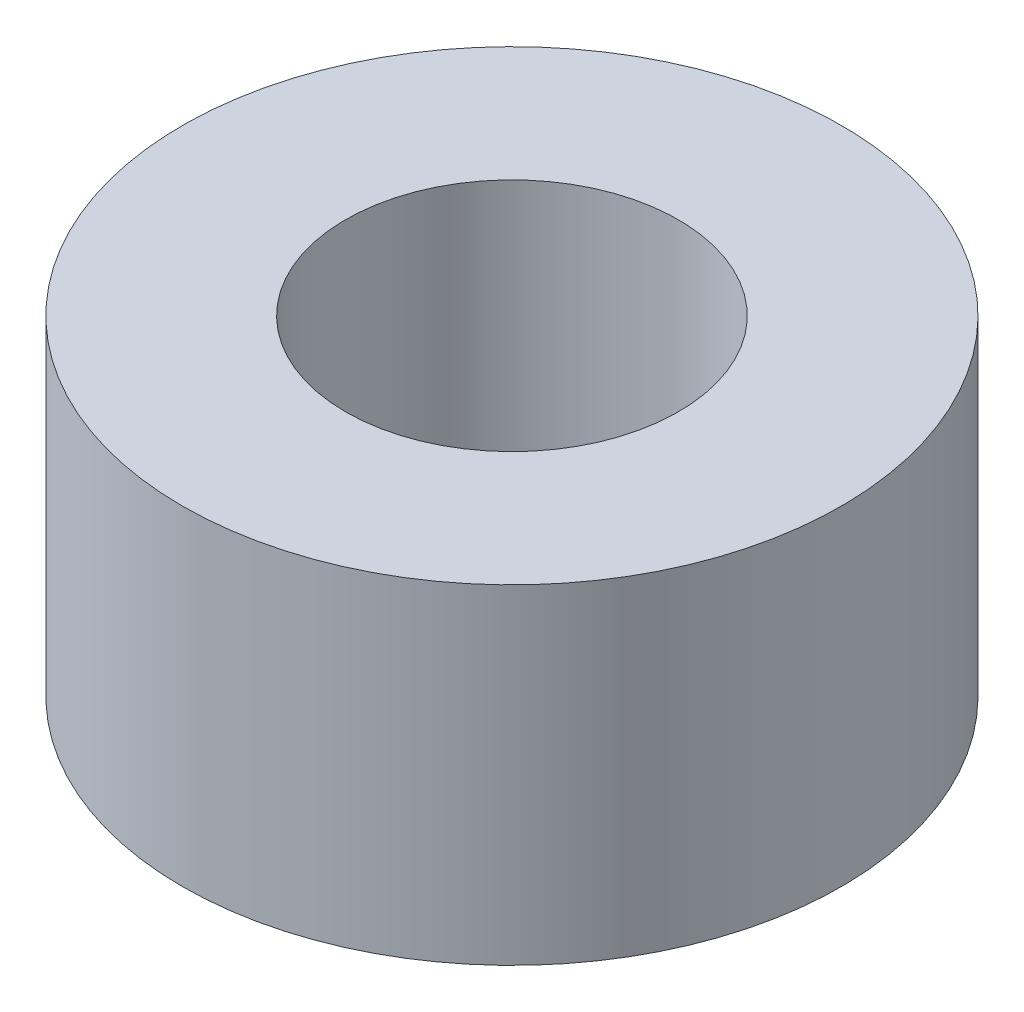
ISO-10303-21;
HEADER;
FILE_DESCRIPTION(('STEP AP214'),'2;1');
FILE_NAME('part.step','',(''),(''),'','','');
FILE_SCHEMA(('AUTOMOTIVE_DESIGN { 1 0 10303 214 1 1 1 1 }'));
ENDSEC;
DATA;
#1=APPLICATION_CONTEXT('core data for automotive mechanical design processes');
#2=APPLICATION_PROTOCOL_DEFINITION('international standard','automotive_design',2000,#1);
#3=PRODUCT_CONTEXT('',#1,'mechanical');
#4=PRODUCT('Part','Part','',(#3));
#5=PRODUCT_RELATED_PRODUCT_CATEGORY('part','',(#4));
#6=PRODUCT_DEFINITION_FORMATION('','',#4);
#7=PRODUCT_DEFINITION_CONTEXT('part definition',#1,'design');
#8=PRODUCT_DEFINITION('design','',#6,#7);
#9=PRODUCT_DEFINITION_SHAPE('','',#8);
#10=(LENGTH_UNIT() NAMED_UNIT(*) SI_UNIT(.MILLI.,.METRE.));
#11=(NAMED_UNIT(*) PLANE_ANGLE_UNIT() SI_UNIT($,.RADIAN.));
#12=(NAMED_UNIT(*) SI_UNIT($,.STERADIAN.) SOLID_ANGLE_UNIT());
#13=UNCERTAINTY_MEASURE_WITH_UNIT(LENGTH_MEASURE(1.E-05),#10,'distance_accuracy_value','');
#14=(GEOMETRIC_REPRESENTATION_CONTEXT(3) GLOBAL_UNCERTAINTY_ASSIGNED_CONTEXT((#13)) GLOBAL_UNIT_ASSIGNED_CONTEXT((#10,
#11,#12)) REPRESENTATION_CONTEXT('',''));
#15=CARTESIAN_POINT('',(0.,0.,0.));
#16=DIRECTION('',(0.,0.,1.));
#17=DIRECTION('',(1.,0.,0.));
#18=AXIS2_PLACEMENT_3D('',#15,#16,#17);
#19=CARTESIAN_POINT('',(0.,2.5,0.));
#20=DIRECTION('',(0.,1.,0.));
#21=DIRECTION('',(0.,0.,1.));
#22=AXIS2_PLACEMENT_3D('',#19,#20,#21);
#23=PLANE('',#22);
#24=CARTESIAN_POINT('',(0.,2.5,0.));
#25=DIRECTION('',(0.,1.,0.));
#26=DIRECTION('',(0.,0.,1.));
#27=AXIS2_PLACEMENT_3D('',#24,#25,#26);
#28=CIRCLE('',#27,5.);
#29=CARTESIAN_POINT('',(0.,2.5,5.));
#30=VERTEX_POINT('',#29);
#31=EDGE_CURVE('E10',#30,#30,#28,.T.);
#32=ORIENTED_EDGE('',*,*,#31,.T.);
#33=EDGE_LOOP('',(#32));
#34=FACE_BOUND('',#33,.T.);
#35=CARTESIAN_POINT('',(0.,2.5,0.));
#36=DIRECTION('',(0.,1.,0.));
#37=DIRECTION('',(0.,0.,1.));
#38=AXIS2_PLACEMENT_3D('',#35,#36,#37);
#39=CIRCLE('',#38,2.525);
#40=CARTESIAN_POINT('',(0.,2.5,2.525));
#41=VERTEX_POINT('',#40);
#42=EDGE_CURVE('E46',#41,#41,#39,.T.);
#43=ORIENTED_EDGE('',*,*,#42,.F.);
#44=EDGE_LOOP('',(#43));
#45=FACE_BOUND('',#44,.T.);
#46=ADVANCED_FACE('F35',(#34,#45),#23,.T.);
#47=CARTESIAN_POINT('',(0.,-2.5,0.));
#48=DIRECTION('',(0.,1.,0.));
#49=DIRECTION('',(0.,0.,1.));
#50=AXIS2_PLACEMENT_3D('',#47,#48,#49);
#51=PLANE('',#50);
#52=CARTESIAN_POINT('',(0.,-2.5,0.));
#53=DIRECTION('',(0.,1.,0.));
#54=DIRECTION('',(0.,0.,1.));
#55=AXIS2_PLACEMENT_3D('',#52,#53,#54);
#56=CIRCLE('',#55,5.);
#57=CARTESIAN_POINT('',(0.,-2.5,5.));
#58=VERTEX_POINT('',#57);
#59=EDGE_CURVE('E39',#58,#58,#56,.T.);
#60=ORIENTED_EDGE('',*,*,#59,.F.);
#61=EDGE_LOOP('',(#60));
#62=FACE_BOUND('',#61,.T.);
#63=CARTESIAN_POINT('',(0.,-2.5,0.));
#64=DIRECTION('',(0.,1.,0.));
#65=DIRECTION('',(0.,0.,1.));
#66=AXIS2_PLACEMENT_3D('',#63,#64,#65);
#67=CIRCLE('',#66,2.525);
#68=CARTESIAN_POINT('',(0.,-2.5,2.525));
#69=VERTEX_POINT('',#68);
#70=EDGE_CURVE('E48',#69,#69,#67,.T.);
#71=ORIENTED_EDGE('',*,*,#70,.T.);
#72=EDGE_LOOP('',(#71));
#73=FACE_BOUND('',#72,.T.);
#74=ADVANCED_FACE('F58',(#62,#73),#51,.F.);
#75=CARTESIAN_POINT('',(0.,2.5,0.));
#76=DIRECTION('',(0.,-1.,0.));
#77=DIRECTION('',(0.,0.,-1.));
#78=AXIS2_PLACEMENT_3D('',#75,#76,#77);
#79=CYLINDRICAL_SURFACE('',#78,5.);
#80=ORIENTED_EDGE('',*,*,#31,.F.);
#81=EDGE_LOOP('',(#80));
#82=FACE_BOUND('',#81,.T.);
#83=ORIENTED_EDGE('',*,*,#59,.T.);
#84=EDGE_LOOP('',(#83));
#85=FACE_BOUND('',#84,.T.);
#86=ADVANCED_FACE('F37',(#82,#85),#79,.T.);
#87=CARTESIAN_POINT('',(0.,2.5,0.));
#88=DIRECTION('',(0.,-1.,0.));
#89=DIRECTION('',(0.,0.,-1.));
#90=AXIS2_PLACEMENT_3D('',#87,#88,#89);
#91=CYLINDRICAL_SURFACE('',#90,2.525);
#92=ORIENTED_EDGE('',*,*,#42,.T.);
#93=EDGE_LOOP('',(#92));
#94=FACE_BOUND('',#93,.T.);
#95=ORIENTED_EDGE('',*,*,#70,.F.);
#96=EDGE_LOOP('',(#95));
#97=FACE_BOUND('',#96,.T.);
#98=ADVANCED_FACE('F54',(#94,#97),#91,.F.);
#99=CLOSED_SHELL('',(#46,#74,#86,#98));
#100=MANIFOLD_SOLID_BREP('B2',#99);
#101=ADVANCED_BREP_SHAPE_REPRESENTATION('',(#18,#100),#14);
#102=SHAPE_DEFINITION_REPRESENTATION(#9,#101);
ENDSEC;
END-ISO-10303-21;
